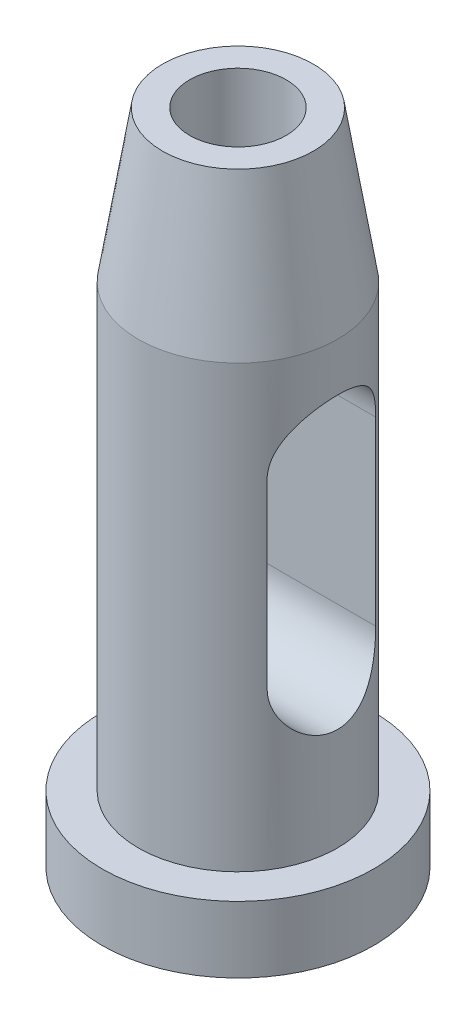
ISO-10303-21;
HEADER;
FILE_DESCRIPTION(('STEP AP214'),'2;1');
FILE_NAME('part.step','',(''),(''),'','','');
FILE_SCHEMA(('AUTOMOTIVE_DESIGN { 1 0 10303 214 1 1 1 1 }'));
ENDSEC;
DATA;
#1=APPLICATION_CONTEXT('core data for automotive mechanical design processes');
#2=APPLICATION_PROTOCOL_DEFINITION('international standard','automotive_design',2000,#1);
#3=PRODUCT_CONTEXT('',#1,'mechanical');
#4=PRODUCT('Part','Part','',(#3));
#5=PRODUCT_RELATED_PRODUCT_CATEGORY('part','',(#4));
#6=PRODUCT_DEFINITION_FORMATION('','',#4);
#7=PRODUCT_DEFINITION_CONTEXT('part definition',#1,'design');
#8=PRODUCT_DEFINITION('design','',#6,#7);
#9=PRODUCT_DEFINITION_SHAPE('','',#8);
#10=(LENGTH_UNIT() NAMED_UNIT(*) SI_UNIT(.MILLI.,.METRE.));
#11=(NAMED_UNIT(*) PLANE_ANGLE_UNIT() SI_UNIT($,.RADIAN.));
#12=(NAMED_UNIT(*) SI_UNIT($,.STERADIAN.) SOLID_ANGLE_UNIT());
#13=UNCERTAINTY_MEASURE_WITH_UNIT(LENGTH_MEASURE(1.E-05),#10,'distance_accuracy_value','');
#14=(GEOMETRIC_REPRESENTATION_CONTEXT(3) GLOBAL_UNCERTAINTY_ASSIGNED_CONTEXT((#13)) GLOBAL_UNIT_ASSIGNED_CONTEXT((#10,
#11,#12)) REPRESENTATION_CONTEXT('',''));
#15=CARTESIAN_POINT('',(0.,0.,0.));
#16=DIRECTION('',(0.,0.,1.));
#17=DIRECTION('',(1.,0.,0.));
#18=AXIS2_PLACEMENT_3D('',#15,#16,#17);
#19=CARTESIAN_POINT('',(0.,0.,0.));
#20=DIRECTION('',(0.,-1.,0.));
#21=DIRECTION('',(0.,0.,-1.));
#22=AXIS2_PLACEMENT_3D('',#19,#20,#21);
#23=PLANE('',#22);
#24=CARTESIAN_POINT('',(0.,0.,0.));
#25=DIRECTION('',(0.,1.,0.));
#26=DIRECTION('',(0.,0.,1.));
#27=AXIS2_PLACEMENT_3D('',#24,#25,#26);
#28=CIRCLE('',#27,22.5);
#29=CARTESIAN_POINT('',(0.,0.,22.5));
#30=VERTEX_POINT('',#29);
#31=EDGE_CURVE('E90',#30,#30,#28,.T.);
#32=ORIENTED_EDGE('',*,*,#31,.F.);
#33=EDGE_LOOP('',(#32));
#34=FACE_BOUND('',#33,.T.);
#35=ADVANCED_FACE('F40',(#34),#23,.T.);
#36=CARTESIAN_POINT('',(0.,109.,0.));
#37=DIRECTION('',(0.,1.,0.));
#38=DIRECTION('',(0.,0.,1.));
#39=AXIS2_PLACEMENT_3D('',#36,#37,#38);
#40=CYLINDRICAL_SURFACE('',#39,22.5);
#41=ORIENTED_EDGE('',*,*,#31,.T.);
#42=EDGE_LOOP('',(#41));
#43=FACE_BOUND('',#42,.T.);
#44=CARTESIAN_POINT('',(0.,11.,0.));
#45=DIRECTION('',(0.,1.,0.));
#46=DIRECTION('',(0.,0.,1.));
#47=AXIS2_PLACEMENT_3D('',#44,#45,#46);
#48=CIRCLE('',#47,22.5);
#49=CARTESIAN_POINT('',(0.,11.,22.5));
#50=VERTEX_POINT('',#49);
#51=EDGE_CURVE('E188',#50,#50,#48,.T.);
#52=ORIENTED_EDGE('',*,*,#51,.F.);
#53=EDGE_LOOP('',(#52));
#54=FACE_BOUND('',#53,.T.);
#55=ADVANCED_FACE('F196',(#43,#54),#40,.T.);
#56=CARTESIAN_POINT('',(0.,11.,22.5));
#57=DIRECTION('',(0.,1.,0.));
#58=DIRECTION('',(0.,0.,1.));
#59=AXIS2_PLACEMENT_3D('',#56,#57,#58);
#60=PLANE('',#59);
#61=ORIENTED_EDGE('',*,*,#51,.T.);
#62=EDGE_LOOP('',(#61));
#63=FACE_BOUND('',#62,.T.);
#64=CARTESIAN_POINT('',(0.,11.,0.));
#65=DIRECTION('',(0.,1.,0.));
#66=DIRECTION('',(0.,0.,1.));
#67=AXIS2_PLACEMENT_3D('',#64,#65,#66);
#68=CIRCLE('',#67,16.5);
#69=CARTESIAN_POINT('',(0.,11.,16.5));
#70=VERTEX_POINT('',#69);
#71=EDGE_CURVE('E184',#70,#70,#68,.T.);
#72=ORIENTED_EDGE('',*,*,#71,.F.);
#73=EDGE_LOOP('',(#72));
#74=FACE_BOUND('',#73,.T.);
#75=ADVANCED_FACE('F203',(#63,#74),#60,.T.);
#76=CARTESIAN_POINT('',(0.,109.,0.));
#77=DIRECTION('',(0.,1.,0.));
#78=DIRECTION('',(0.,0.,1.));
#79=AXIS2_PLACEMENT_3D('',#76,#77,#78);
#80=CYLINDRICAL_SURFACE('',#79,16.5);
#81=CARTESIAN_POINT('',(-13.8293166859393,37.,-9.));
#82=CARTESIAN_POINT('',(-13.8293134815957,36.883879337799,-9.00000108405973));
#83=CARTESIAN_POINT('',(-13.8307798704048,36.767775676521,-8.99775214358709));
#84=CARTESIAN_POINT('',(-13.8366193112443,36.535821083373,-8.98877121495076));
#85=CARTESIAN_POINT('',(-13.8409922095959,36.4199701384656,-8.98203946381126));
#86=CARTESIAN_POINT('',(-13.8584105490117,36.0733363645537,-8.95516299690755));
#87=CARTESIAN_POINT('',(-13.8757557630275,35.8432404071181,-8.92833699369042));
#88=CARTESIAN_POINT('',(-13.9210734017257,35.3884183518615,-8.85750818535109));
#89=CARTESIAN_POINT('',(-13.948973865982,35.1636666093085,-8.81362163589781));
#90=CARTESIAN_POINT('',(-14.0143719159858,34.7194526295796,-8.70925748833242));
#91=CARTESIAN_POINT('',(-14.051870928749,34.4999911842248,-8.64877742316692));
#92=CARTESIAN_POINT('',(-14.1350539016855,34.0683671001684,-8.51214530056127));
#93=CARTESIAN_POINT('',(-14.1807127706843,33.8561843989006,-8.43604118253432));
#94=CARTESIAN_POINT('',(-14.2788853710004,33.4394344654245,-8.26878667099399));
#95=CARTESIAN_POINT('',(-14.3314017477403,33.2348702115299,-8.17763046722479));
#96=CARTESIAN_POINT('',(-14.4971809528376,32.6334424598125,-7.88243166380446));
#97=CARTESIAN_POINT('',(-14.6185947922113,32.2492309081074,-7.65678284557668));
#98=CARTESIAN_POINT('',(-14.8838866236824,31.4844351884652,-7.12849041565851));
#99=CARTESIAN_POINT('',(-15.0287993297978,31.107936993416,-6.82045172463468));
#100=CARTESIAN_POINT('',(-15.2444045744132,30.5838378370052,-6.31599281999726));
#101=CARTESIAN_POINT('',(-15.3160142934886,30.4158391778875,-6.1406750094819));
#102=CARTESIAN_POINT('',(-15.4570552574956,30.0940974569534,-5.77646350594257));
#103=CARTESIAN_POINT('',(-15.5264861580652,29.9403566411547,-5.58756768228476));
#104=CARTESIAN_POINT('',(-15.6672413772283,29.6357479801947,-5.18051796077378));
#105=CARTESIAN_POINT('',(-15.7382291902257,29.4862228344667,-4.96124072193462));
#106=CARTESIAN_POINT('',(-15.8737205268866,29.2064140706764,-4.5089564833478));
#107=CARTESIAN_POINT('',(-15.9382268596804,29.0761221051991,-4.27595550165028));
#108=CARTESIAN_POINT('',(-16.058921036249,28.8360727806561,-3.79761413251478));
#109=CARTESIAN_POINT('',(-16.1151113722364,28.726309266829,-3.55227747159334));
#110=CARTESIAN_POINT('',(-16.2174945514722,28.5286196429743,-3.05094857264157));
#111=CARTESIAN_POINT('',(-16.2636886996486,28.4406906823871,-2.79495773064356));
#112=CARTESIAN_POINT('',(-16.3412924021232,28.2941761837752,-2.29578601596137));
#113=CARTESIAN_POINT('',(-16.3736041366231,28.2337747817225,-2.05327784299602));
#114=CARTESIAN_POINT('',(-16.4276612226378,28.1332161396188,-1.56293437886735));
#115=CARTESIAN_POINT('',(-16.4494071030839,28.0930578861836,-1.31509935501719));
#116=CARTESIAN_POINT('',(-16.4816853742424,28.0335861975899,-0.816366884020454));
#117=CARTESIAN_POINT('',(-16.4922245977025,28.0142600609005,-0.565471397355101));
#118=CARTESIAN_POINT('',(-16.5017954787214,27.9967054791063,-0.0627317539663012));
#119=CARTESIAN_POINT('',(-16.50082802665,27.9984754016194,0.189112327848731));
#120=CARTESIAN_POINT('',(-16.4881140513944,28.0218053769525,0.665502054373425));
#121=CARTESIAN_POINT('',(-16.4774903933769,28.0413039418605,0.890182334898735));
#122=CARTESIAN_POINT('',(-16.4472768638071,28.0969968405522,1.33685629531056));
#123=CARTESIAN_POINT('',(-16.4276869430148,28.1331912660244,1.55884996043612));
#124=CARTESIAN_POINT('',(-16.380001691922,28.2218538300547,1.99861633516903));
#125=CARTESIAN_POINT('',(-16.3519065907322,28.274321530248,2.21638915830833));
#126=CARTESIAN_POINT('',(-16.287850823767,28.3949611136514,2.64635039092244));
#127=CARTESIAN_POINT('',(-16.2518898544155,28.4631336029791,2.85853858450924));
#128=CARTESIAN_POINT('',(-16.1724544241406,28.6153386147169,3.27839087347572));
#129=CARTESIAN_POINT('',(-16.1289025338257,28.6995354951066,3.48598071121282));
#130=CARTESIAN_POINT('',(-16.0354892632859,28.882544427667,3.89317238156783));
#131=CARTESIAN_POINT('',(-15.9856258057915,28.9813612933985,4.09277155569199));
#132=CARTESIAN_POINT('',(-15.8280900344313,29.2985524826622,4.6780854188988));
#133=CARTESIAN_POINT('',(-15.7124221771135,29.5377607886603,5.05057142696184));
#134=CARTESIAN_POINT('',(-15.4556692787488,30.0938519193487,5.7915533699411));
#135=CARTESIAN_POINT('',(-15.3131891684231,30.416296453486,6.1553916221143));
#136=CARTESIAN_POINT('',(-15.0979492139108,30.9400196925103,6.65848604251197));
#137=CARTESIAN_POINT('',(-15.0258813463276,31.1214581254447,6.81920359907351));
#138=CARTESIAN_POINT('',(-14.8829449335362,31.4970705530637,7.12576361305457));
#139=CARTESIAN_POINT('',(-14.8120765967277,31.6912467327344,7.27160350739421));
#140=CARTESIAN_POINT('',(-14.667370449346,32.1088482757656,7.55952537759443));
#141=CARTESIAN_POINT('',(-14.593807402387,32.3333501755625,7.70018681476335));
#142=CARTESIAN_POINT('',(-14.4527381260324,32.7952459242011,7.96181155290304));
#143=CARTESIAN_POINT('',(-14.3852291413342,33.0326338286299,8.08278383536833));
#144=CARTESIAN_POINT('',(-14.2588712919875,33.5185749971631,8.3036590486665));
#145=CARTESIAN_POINT('',(-14.2000033794566,33.76710207738,8.40360853825212));
#146=CARTESIAN_POINT('',(-14.0932226684338,34.2741530660208,8.58148374258627));
#147=CARTESIAN_POINT('',(-14.0453053206661,34.5326727707568,8.65941860622515));
#148=CARTESIAN_POINT('',(-13.9759024717337,34.9734488902373,8.77080106889329));
#149=CARTESIAN_POINT('',(-13.9508676002974,35.1535934284484,8.81050140549166));
#150=CARTESIAN_POINT('',(-13.9074662102012,35.5167275050034,8.87885237923901));
#151=CARTESIAN_POINT('',(-13.8890977900302,35.6997162165327,8.90750616740534));
#152=CARTESIAN_POINT('',(-13.8594431186528,36.0683513246452,8.95358220283994));
#153=CARTESIAN_POINT('',(-13.8481827209869,36.2540049395411,8.97096345546967));
#154=CARTESIAN_POINT('',(-13.8331000847177,36.6264335118903,8.99418564095055));
#155=CARTESIAN_POINT('',(-13.8292819358322,36.8132090293461,9.00002022862284));
#156=CARTESIAN_POINT('',(-13.8293166859393,37.,9.));
#157=B_SPLINE_CURVE_WITH_KNOTS('',3,(#81,#82,#83,#84,#85,#86,#87,#88,#89,#90,#91,#92,#93,#94,
#95,#96,#97,#98,#99,#100,#101,#102,#103,#104,#105,#106,#107,#108,#109,#110,#111,#112,#113,#114,
#115,#116,#117,#118,#119,#120,#121,#122,#123,#124,#125,#126,#127,#128,#129,#130,#131,#132,#133,
#134,#135,#136,#137,#138,#139,#140,#141,#142,#143,#144,#145,#146,#147,#148,#149,#150,#151,#152,
#153,#154,#155,#156),.UNSPECIFIED.,.F.,.F.,(4,2,2,2,2,2,2,2,2,2,2,2,2,2,2,2,2,2,2,2,2,2,2,2,2,2,
2,2,2,2,2,2,2,2,2,2,2,4),(0.,0.348297459707134,0.696576504992709,1.39244069466339,
2.08364390864056,2.77494994351385,3.46416571704895,4.15364815938686,5.53384137472792,
7.05000030935543,7.80883706644962,8.56779315968766,9.39093850464086,10.2137255382555,
11.0362654901795,11.8586980007831,12.6136393478522,13.3685428983421,14.1229859164749,
14.8773705572975,15.5538916107622,16.2304163795213,16.9069229258351,17.5834555859257,
18.2673428369038,18.9514557576741,20.3188620596813,21.8320268865112,22.5900243598057,
23.348152198926,24.1719696394774,24.9954102240249,25.8170074892098,26.6382628090292,
27.1963145005412,27.7542068903533,28.3141169470546,28.8743346028807),.UNSPECIFIED.);
#158=CARTESIAN_POINT('',(-13.8293166859393,37.,-9.));
#159=VERTEX_POINT('',#158);
#160=CARTESIAN_POINT('',(-13.8293166859393,37.,9.));
#161=VERTEX_POINT('',#160);
#162=EDGE_CURVE('E11',#159,#161,#157,.T.);
#163=ORIENTED_EDGE('',*,*,#162,.F.);
#164=DIRECTION('',(0.,1.,0.));
#165=VECTOR('',#164,1.);
#166=CARTESIAN_POINT('',(-13.8293166859393,109.,-9.));
#167=LINE('',#166,#165);
#168=CARTESIAN_POINT('',(-13.8293166859393,67.,-9.));
#169=VERTEX_POINT('',#168);
#170=EDGE_CURVE('E139',#169,#159,#167,.F.);
#171=ORIENTED_EDGE('',*,*,#170,.F.);
#172=CARTESIAN_POINT('',(-13.8293166859393,67.,9.));
#173=CARTESIAN_POINT('',(-13.8293134815957,67.116120662201,9.00000108405973));
#174=CARTESIAN_POINT('',(-13.8307798704048,67.232224323479,8.99775214358709));
#175=CARTESIAN_POINT('',(-13.8366193112443,67.464178916627,8.98877121495076));
#176=CARTESIAN_POINT('',(-13.8409922095959,67.5800298615344,8.98203946381125));
#177=CARTESIAN_POINT('',(-13.8584105490117,67.9266636354463,8.95516299690755));
#178=CARTESIAN_POINT('',(-13.8757557630275,68.1567595928819,8.92833699369042));
#179=CARTESIAN_POINT('',(-13.9210734017257,68.6115816481385,8.85750818535109));
#180=CARTESIAN_POINT('',(-13.948973865982,68.8363333906915,8.8136216358978));
#181=CARTESIAN_POINT('',(-14.0143719159858,69.2805473704204,8.70925748833241));
#182=CARTESIAN_POINT('',(-14.051870928749,69.5000088157752,8.64877742316692));
#183=CARTESIAN_POINT('',(-14.1350539016855,69.9316328998316,8.51214530056127));
#184=CARTESIAN_POINT('',(-14.1807127706843,70.1438156010994,8.43604118253433));
#185=CARTESIAN_POINT('',(-14.2788853710004,70.5605655345755,8.268786670994));
#186=CARTESIAN_POINT('',(-14.3314017477403,70.7651297884701,8.17763046722479));
#187=CARTESIAN_POINT('',(-14.4971809528376,71.3665575401875,7.88243166380445));
#188=CARTESIAN_POINT('',(-14.6185947922114,71.7507690918926,7.65678284557668));
#189=CARTESIAN_POINT('',(-14.8838866236824,72.5155648115348,7.12849041565851));
#190=CARTESIAN_POINT('',(-15.0287993297978,72.892063006584,6.82045172463468));
#191=CARTESIAN_POINT('',(-15.2444045744132,73.4161621629948,6.31599281999725));
#192=CARTESIAN_POINT('',(-15.3160142934886,73.5841608221125,6.14067500948189));
#193=CARTESIAN_POINT('',(-15.4570552574956,73.9059025430467,5.77646350594256));
#194=CARTESIAN_POINT('',(-15.5264861580652,74.0596433588453,5.58756768228475));
#195=CARTESIAN_POINT('',(-15.6672413772284,74.3642520198053,5.18051796077377));
#196=CARTESIAN_POINT('',(-15.7382291902257,74.5137771655333,4.96124072193461));
#197=CARTESIAN_POINT('',(-15.8737205268866,74.7935859293236,4.5089564833478));
#198=CARTESIAN_POINT('',(-15.9382268596804,74.9238778948009,4.27595550165028));
#199=CARTESIAN_POINT('',(-16.058921036249,75.1639272193439,3.79761413251478));
#200=CARTESIAN_POINT('',(-16.1151113722364,75.273690733171,3.55227747159334));
#201=CARTESIAN_POINT('',(-16.2174945514722,75.4713803570257,3.05094857264157));
#202=CARTESIAN_POINT('',(-16.2636886996486,75.5593093176129,2.79495773064357));
#203=CARTESIAN_POINT('',(-16.3412924021232,75.7058238162248,2.29578601596138));
#204=CARTESIAN_POINT('',(-16.3736041366231,75.7662252182775,2.05327784299602));
#205=CARTESIAN_POINT('',(-16.4276612226378,75.8667838603812,1.56293437886736));
#206=CARTESIAN_POINT('',(-16.4494071030839,75.9069421138164,1.3150993550172));
#207=CARTESIAN_POINT('',(-16.4816853742424,75.9664138024101,0.816366884020461));
#208=CARTESIAN_POINT('',(-16.4922245977025,75.9857399390995,0.565471397355108));
#209=CARTESIAN_POINT('',(-16.5017954787214,76.0032945208937,0.0627317539663093));
#210=CARTESIAN_POINT('',(-16.50082802665,76.0015245983806,-0.189112327848721));
#211=CARTESIAN_POINT('',(-16.4881140513944,75.9781946230475,-0.665502054373416));
#212=CARTESIAN_POINT('',(-16.4774903933769,75.9586960581395,-0.890182334898726));
#213=CARTESIAN_POINT('',(-16.4472768638071,75.9030031594478,-1.33685629531055));
#214=CARTESIAN_POINT('',(-16.4276869430148,75.8668087339756,-1.55884996043611));
#215=CARTESIAN_POINT('',(-16.380001691922,75.7781461699453,-1.99861633516902));
#216=CARTESIAN_POINT('',(-16.3519065907322,75.725678469752,-2.21638915830832));
#217=CARTESIAN_POINT('',(-16.287850823767,75.6050388863487,-2.64635039092243));
#218=CARTESIAN_POINT('',(-16.2518898544155,75.5368663970209,-2.85853858450924));
#219=CARTESIAN_POINT('',(-16.1724544241406,75.3846613852831,-3.27839087347571));
#220=CARTESIAN_POINT('',(-16.1289025338257,75.3004645048934,-3.48598071121281));
#221=CARTESIAN_POINT('',(-16.0354892632859,75.117455572333,-3.89317238156782));
#222=CARTESIAN_POINT('',(-15.9856258057915,75.0186387066015,-4.09277155569198));
#223=CARTESIAN_POINT('',(-15.8280900344313,74.7014475173378,-4.67808541889879));
#224=CARTESIAN_POINT('',(-15.7124221771135,74.4622392113397,-5.05057142696183));
#225=CARTESIAN_POINT('',(-15.4556692787488,73.9061480806513,-5.7915533699411));
#226=CARTESIAN_POINT('',(-15.3131891684231,73.5837035465141,-6.1553916221143));
#227=CARTESIAN_POINT('',(-15.0979492139108,73.0599803074897,-6.65848604251197));
#228=CARTESIAN_POINT('',(-15.0258813463276,72.8785418745553,-6.8192035990735));
#229=CARTESIAN_POINT('',(-14.8829449335362,72.5029294469363,-7.12576361305456));
#230=CARTESIAN_POINT('',(-14.8120765967277,72.3087532672656,-7.27160350739421));
#231=CARTESIAN_POINT('',(-14.667370449346,71.8911517242344,-7.55952537759443));
#232=CARTESIAN_POINT('',(-14.593807402387,71.6666498244375,-7.70018681476335));
#233=CARTESIAN_POINT('',(-14.4527381260324,71.2047540757989,-7.96181155290304));
#234=CARTESIAN_POINT('',(-14.3852291413342,70.9673661713701,-8.08278383536833));
#235=CARTESIAN_POINT('',(-14.2588712919875,70.4814250028369,-8.30365904866649));
#236=CARTESIAN_POINT('',(-14.2000033794566,70.23289792262,-8.40360853825212));
#237=CARTESIAN_POINT('',(-14.0932226684338,69.7258469339792,-8.58148374258626));
#238=CARTESIAN_POINT('',(-14.045305320666,69.4673272292432,-8.65941860622514));
#239=CARTESIAN_POINT('',(-13.9759024717337,69.0265511097627,-8.77080106889329));
#240=CARTESIAN_POINT('',(-13.9508676002974,68.8464065715516,-8.81050140549166));
#241=CARTESIAN_POINT('',(-13.9074662102012,68.4832724949966,-8.87885237923901));
#242=CARTESIAN_POINT('',(-13.8890977900302,68.3002837834673,-8.90750616740534));
#243=CARTESIAN_POINT('',(-13.8594431186528,67.9316486753548,-8.95358220283994));
#244=CARTESIAN_POINT('',(-13.8481827209869,67.7459950604589,-8.97096345546966));
#245=CARTESIAN_POINT('',(-13.8331000847177,67.3735664881097,-8.99418564095055));
#246=CARTESIAN_POINT('',(-13.8292819358322,67.186790970654,-9.00002022862284));
#247=CARTESIAN_POINT('',(-13.8293166859393,67.,-9.));
#248=B_SPLINE_CURVE_WITH_KNOTS('',3,(#172,#173,#174,#175,#176,#177,#178,#179,#180,#181,#182,
#183,#184,#185,#186,#187,#188,#189,#190,#191,#192,#193,#194,#195,#196,#197,#198,#199,#200,#201,
#202,#203,#204,#205,#206,#207,#208,#209,#210,#211,#212,#213,#214,#215,#216,#217,#218,#219,#220,
#221,#222,#223,#224,#225,#226,#227,#228,#229,#230,#231,#232,#233,#234,#235,#236,#237,#238,#239,
#240,#241,#242,#243,#244,#245,#246,#247),.UNSPECIFIED.,.F.,.F.,(4,2,2,2,2,2,2,2,2,2,2,2,2,2,2,2,
2,2,2,2,2,2,2,2,2,2,2,2,2,2,2,2,2,2,2,2,2,4),(0.,0.348297459707154,0.696576504992716,
1.3924406946634,2.08364390864056,2.77494994351385,3.46416571704895,4.15364815938687,
5.53384137472791,7.05000030935543,7.80883706644962,8.56779315968767,9.39093850464086,
10.2137255382555,11.0362654901795,11.8586980007831,12.6136393478522,13.3685428983421,
14.1229859164749,14.8773705572975,15.5538916107622,16.2304163795213,16.9069229258351,
17.5834555859257,18.2673428369038,18.951455757674,20.3188620596813,21.8320268865112,
22.5900243598057,23.348152198926,24.1719696394774,24.9954102240249,25.8170074892098,
26.6382628090292,27.1963145005412,27.7542068903533,28.3141169470545,28.8743346028807),.UNSPECIFIED.);
#249=CARTESIAN_POINT('',(-13.8293166859393,67.,9.));
#250=VERTEX_POINT('',#249);
#251=EDGE_CURVE('E97',#250,#169,#248,.T.);
#252=ORIENTED_EDGE('',*,*,#251,.F.);
#253=DIRECTION('',(0.,1.,0.));
#254=VECTOR('',#253,1.);
#255=CARTESIAN_POINT('',(-13.8293166859393,109.,9.));
#256=LINE('',#255,#254);
#257=EDGE_CURVE('E54',#161,#250,#256,.T.);
#258=ORIENTED_EDGE('',*,*,#257,.F.);
#259=EDGE_LOOP('',(#163,#171,#252,#258));
#260=FACE_BOUND('',#259,.T.);
#261=CARTESIAN_POINT('',(13.8293166859393,37.,9.));
#262=CARTESIAN_POINT('',(13.8293134815957,36.883879337799,9.00000108405973));
#263=CARTESIAN_POINT('',(13.8307798704048,36.767775676521,8.99775214358709));
#264=CARTESIAN_POINT('',(13.8366193112443,36.535821083373,8.98877121495076));
#265=CARTESIAN_POINT('',(13.8409922095959,36.4199701384656,8.98203946381126));
#266=CARTESIAN_POINT('',(13.8584105490117,36.0733363645537,8.95516299690755));
#267=CARTESIAN_POINT('',(13.8757557630275,35.8432404071181,8.92833699369042));
#268=CARTESIAN_POINT('',(13.9210734017257,35.3884183518615,8.85750818535109));
#269=CARTESIAN_POINT('',(13.948973865982,35.1636666093085,8.81362163589781));
#270=CARTESIAN_POINT('',(14.0143719159858,34.7194526295796,8.70925748833242));
#271=CARTESIAN_POINT('',(14.051870928749,34.4999911842248,8.64877742316692));
#272=CARTESIAN_POINT('',(14.1350539016855,34.0683671001684,8.51214530056127));
#273=CARTESIAN_POINT('',(14.1807127706843,33.8561843989006,8.43604118253432));
#274=CARTESIAN_POINT('',(14.2788853710004,33.4394344654245,8.26878667099399));
#275=CARTESIAN_POINT('',(14.3314017477403,33.2348702115299,8.17763046722479));
#276=CARTESIAN_POINT('',(14.4971809528376,32.6334424598125,7.88243166380446));
#277=CARTESIAN_POINT('',(14.6185947922113,32.2492309081074,7.65678284557669));
#278=CARTESIAN_POINT('',(14.8838866236824,31.4844351884652,7.12849041565851));
#279=CARTESIAN_POINT('',(15.0287993297978,31.107936993416,6.82045172463468));
#280=CARTESIAN_POINT('',(15.2444045744132,30.5838378370052,6.31599281999726));
#281=CARTESIAN_POINT('',(15.3160142934885,30.4158391778875,6.1406750094819));
#282=CARTESIAN_POINT('',(15.4570552574956,30.0940974569534,5.77646350594258));
#283=CARTESIAN_POINT('',(15.5264861580652,29.9403566411547,5.58756768228476));
#284=CARTESIAN_POINT('',(15.6672413772284,29.6357479801947,5.18051796077379));
#285=CARTESIAN_POINT('',(15.7382291902257,29.4862228344667,4.96124072193463));
#286=CARTESIAN_POINT('',(15.8737205268866,29.2064140706764,4.50895648334781));
#287=CARTESIAN_POINT('',(15.9382268596804,29.0761221051991,4.27595550165029));
#288=CARTESIAN_POINT('',(16.058921036249,28.8360727806561,3.79761413251478));
#289=CARTESIAN_POINT('',(16.1151113722364,28.726309266829,3.55227747159334));
#290=CARTESIAN_POINT('',(16.2174945514722,28.5286196429743,3.05094857264157));
#291=CARTESIAN_POINT('',(16.2636886996486,28.4406906823871,2.79495773064357));
#292=CARTESIAN_POINT('',(16.3412924021232,28.2941761837752,2.29578601596138));
#293=CARTESIAN_POINT('',(16.3736041366231,28.2337747817225,2.05327784299602));
#294=CARTESIAN_POINT('',(16.4276612226378,28.1332161396188,1.56293437886736));
#295=CARTESIAN_POINT('',(16.4494071030839,28.0930578861836,1.3150993550172));
#296=CARTESIAN_POINT('',(16.4816853742424,28.0335861975899,0.816366884020459));
#297=CARTESIAN_POINT('',(16.4922245977025,28.0142600609005,0.565471397355106));
#298=CARTESIAN_POINT('',(16.5017954787214,27.9967054791063,0.062731753966306));
#299=CARTESIAN_POINT('',(16.50082802665,27.9984754016194,-0.189112327848726));
#300=CARTESIAN_POINT('',(16.4881140513944,28.0218053769525,-0.665502054373421));
#301=CARTESIAN_POINT('',(16.4774903933769,28.0413039418605,-0.890182334898731));
#302=CARTESIAN_POINT('',(16.4472768638071,28.0969968405522,-1.33685629531056));
#303=CARTESIAN_POINT('',(16.4276869430148,28.1331912660244,-1.55884996043611));
#304=CARTESIAN_POINT('',(16.380001691922,28.2218538300547,-1.99861633516903));
#305=CARTESIAN_POINT('',(16.3519065907322,28.274321530248,-2.21638915830833));
#306=CARTESIAN_POINT('',(16.287850823767,28.3949611136514,-2.64635039092244));
#307=CARTESIAN_POINT('',(16.2518898544155,28.4631336029791,-2.85853858450924));
#308=CARTESIAN_POINT('',(16.1724544241406,28.6153386147169,-3.27839087347572));
#309=CARTESIAN_POINT('',(16.1289025338257,28.6995354951066,-3.48598071121282));
#310=CARTESIAN_POINT('',(16.0354892632859,28.882544427667,-3.89317238156783));
#311=CARTESIAN_POINT('',(15.9856258057915,28.9813612933985,-4.09277155569198));
#312=CARTESIAN_POINT('',(15.8280900344313,29.2985524826622,-4.67808541889879));
#313=CARTESIAN_POINT('',(15.7124221771135,29.5377607886603,-5.05057142696184));
#314=CARTESIAN_POINT('',(15.4556692787488,30.0938519193487,-5.7915533699411));
#315=CARTESIAN_POINT('',(15.3131891684231,30.416296453486,-6.1553916221143));
#316=CARTESIAN_POINT('',(15.0979492139108,30.9400196925103,-6.65848604251197));
#317=CARTESIAN_POINT('',(15.0258813463276,31.1214581254447,-6.81920359907351));
#318=CARTESIAN_POINT('',(14.8829449335362,31.4970705530637,-7.12576361305457));
#319=CARTESIAN_POINT('',(14.8120765967277,31.6912467327344,-7.27160350739421));
#320=CARTESIAN_POINT('',(14.667370449346,32.1088482757656,-7.55952537759443));
#321=CARTESIAN_POINT('',(14.593807402387,32.3333501755625,-7.70018681476335));
#322=CARTESIAN_POINT('',(14.4527381260324,32.7952459242011,-7.96181155290304));
#323=CARTESIAN_POINT('',(14.3852291413342,33.0326338286299,-8.08278383536833));
#324=CARTESIAN_POINT('',(14.2588712919875,33.5185749971631,-8.3036590486665));
#325=CARTESIAN_POINT('',(14.2000033794566,33.76710207738,-8.40360853825212));
#326=CARTESIAN_POINT('',(14.0932226684338,34.2741530660208,-8.58148374258626));
#327=CARTESIAN_POINT('',(14.045305320666,34.5326727707568,-8.65941860622515));
#328=CARTESIAN_POINT('',(13.9759024717337,34.9734488902373,-8.7708010688933));
#329=CARTESIAN_POINT('',(13.9508676002974,35.1535934284484,-8.81050140549166));
#330=CARTESIAN_POINT('',(13.9074662102012,35.5167275050034,-8.87885237923901));
#331=CARTESIAN_POINT('',(13.8890977900302,35.6997162165327,-8.90750616740534));
#332=CARTESIAN_POINT('',(13.8594431186528,36.0683513246453,-8.95358220283994));
#333=CARTESIAN_POINT('',(13.8481827209869,36.2540049395412,-8.97096345546967));
#334=CARTESIAN_POINT('',(13.8331000847177,36.6264335118903,-8.99418564095055));
#335=CARTESIAN_POINT('',(13.8292819358322,36.8132090293461,-9.00002022862284));
#336=CARTESIAN_POINT('',(13.8293166859393,37.,-9.));
#337=B_SPLINE_CURVE_WITH_KNOTS('',3,(#261,#262,#263,#264,#265,#266,#267,#268,#269,#270,#271,
#272,#273,#274,#275,#276,#277,#278,#279,#280,#281,#282,#283,#284,#285,#286,#287,#288,#289,#290,
#291,#292,#293,#294,#295,#296,#297,#298,#299,#300,#301,#302,#303,#304,#305,#306,#307,#308,#309,
#310,#311,#312,#313,#314,#315,#316,#317,#318,#319,#320,#321,#322,#323,#324,#325,#326,#327,#328,
#329,#330,#331,#332,#333,#334,#335,#336),.UNSPECIFIED.,.F.,.F.,(4,2,2,2,2,2,2,2,2,2,2,2,2,2,2,2,
2,2,2,2,2,2,2,2,2,2,2,2,2,2,2,2,2,2,2,2,2,4),(0.,0.348297459707134,0.696576504992709,
1.39244069466339,2.08364390864056,2.77494994351385,3.46416571704895,4.15364815938686,
5.53384137472792,7.05000030935542,7.80883706644961,8.56779315968765,9.39093850464085,
10.2137255382555,11.0362654901795,11.8586980007831,12.6136393478522,13.3685428983421,
14.1229859164749,14.8773705572975,15.5538916107622,16.2304163795213,16.9069229258351,
17.5834555859257,18.2673428369038,18.951455757674,20.3188620596813,21.8320268865112,
22.5900243598057,23.348152198926,24.1719696394774,24.9954102240249,25.8170074892098,
26.6382628090292,27.1963145005412,27.7542068903533,28.3141169470546,28.8743346028807),.UNSPECIFIED.);
#338=CARTESIAN_POINT('',(13.8293166859393,37.,9.));
#339=VERTEX_POINT('',#338);
#340=CARTESIAN_POINT('',(13.8293166859393,37.,-9.));
#341=VERTEX_POINT('',#340);
#342=EDGE_CURVE('E110',#339,#341,#337,.T.);
#343=ORIENTED_EDGE('',*,*,#342,.F.);
#344=DIRECTION('',(0.,1.,0.));
#345=VECTOR('',#344,1.);
#346=CARTESIAN_POINT('',(13.8293166859393,109.,9.));
#347=LINE('',#346,#345);
#348=CARTESIAN_POINT('',(13.8293166859393,67.,9.));
#349=VERTEX_POINT('',#348);
#350=EDGE_CURVE('E105',#349,#339,#347,.F.);
#351=ORIENTED_EDGE('',*,*,#350,.F.);
#352=CARTESIAN_POINT('',(13.8293166859393,67.,-9.));
#353=CARTESIAN_POINT('',(13.8293134815957,67.116120662201,-9.00000108405973));
#354=CARTESIAN_POINT('',(13.8307798704048,67.232224323479,-8.99775214358709));
#355=CARTESIAN_POINT('',(13.8366193112443,67.464178916627,-8.98877121495076));
#356=CARTESIAN_POINT('',(13.8409922095959,67.5800298615344,-8.98203946381125));
#357=CARTESIAN_POINT('',(13.8584105490117,67.9266636354462,-8.95516299690755));
#358=CARTESIAN_POINT('',(13.8757557630275,68.1567595928819,-8.92833699369042));
#359=CARTESIAN_POINT('',(13.9210734017257,68.6115816481384,-8.8575081853511));
#360=CARTESIAN_POINT('',(13.948973865982,68.8363333906915,-8.81362163589781));
#361=CARTESIAN_POINT('',(14.0143719159858,69.2805473704204,-8.70925748833242));
#362=CARTESIAN_POINT('',(14.051870928749,69.5000088157752,-8.64877742316692));
#363=CARTESIAN_POINT('',(14.1350539016855,69.9316328998316,-8.51214530056128));
#364=CARTESIAN_POINT('',(14.1807127706843,70.1438156010994,-8.43604118253433));
#365=CARTESIAN_POINT('',(14.2788853710004,70.5605655345755,-8.26878667099401));
#366=CARTESIAN_POINT('',(14.3314017477402,70.7651297884701,-8.1776304672248));
#367=CARTESIAN_POINT('',(14.4971809528376,71.3665575401875,-7.88243166380447));
#368=CARTESIAN_POINT('',(14.6185947922113,71.7507690918926,-7.6567828455767));
#369=CARTESIAN_POINT('',(14.8838866236824,72.5155648115348,-7.12849041565853));
#370=CARTESIAN_POINT('',(15.0287993297978,72.892063006584,-6.82045172463469));
#371=CARTESIAN_POINT('',(15.2444045744132,73.4161621629948,-6.31599281999727));
#372=CARTESIAN_POINT('',(15.3160142934885,73.5841608221125,-6.14067500948192));
#373=CARTESIAN_POINT('',(15.4570552574956,73.9059025430466,-5.77646350594259));
#374=CARTESIAN_POINT('',(15.5264861580652,74.0596433588453,-5.58756768228478));
#375=CARTESIAN_POINT('',(15.6672413772283,74.3642520198052,-5.18051796077381));
#376=CARTESIAN_POINT('',(15.7382291902257,74.5137771655333,-4.96124072193464));
#377=CARTESIAN_POINT('',(15.8737205268866,74.7935859293236,-4.50895648334782));
#378=CARTESIAN_POINT('',(15.9382268596804,74.9238778948009,-4.2759555016503));
#379=CARTESIAN_POINT('',(16.058921036249,75.1639272193439,-3.7976141325148));
#380=CARTESIAN_POINT('',(16.1151113722363,75.273690733171,-3.55227747159337));
#381=CARTESIAN_POINT('',(16.2174945514722,75.4713803570257,-3.05094857264159));
#382=CARTESIAN_POINT('',(16.2636886996486,75.5593093176129,-2.79495773064358));
#383=CARTESIAN_POINT('',(16.3412924021232,75.7058238162248,-2.2957860159614));
#384=CARTESIAN_POINT('',(16.3736041366231,75.7662252182775,-2.05327784299604));
#385=CARTESIAN_POINT('',(16.4276612226378,75.8667838603812,-1.56293437886738));
#386=CARTESIAN_POINT('',(16.4494071030839,75.9069421138164,-1.31509935501722));
#387=CARTESIAN_POINT('',(16.4816853742424,75.9664138024101,-0.816366884020478));
#388=CARTESIAN_POINT('',(16.4922245977025,75.9857399390995,-0.565471397355126));
#389=CARTESIAN_POINT('',(16.5017954787214,76.0032945208937,-0.0627317539663271));
#390=CARTESIAN_POINT('',(16.50082802665,76.0015245983806,0.189112327848703));
#391=CARTESIAN_POINT('',(16.4881140513944,75.9781946230475,0.665502054373398));
#392=CARTESIAN_POINT('',(16.4774903933769,75.9586960581395,0.890182334898709));
#393=CARTESIAN_POINT('',(16.4472768638071,75.9030031594478,1.33685629531053));
#394=CARTESIAN_POINT('',(16.4276869430148,75.8668087339756,1.55884996043609));
#395=CARTESIAN_POINT('',(16.380001691922,75.7781461699453,1.99861633516901));
#396=CARTESIAN_POINT('',(16.3519065907322,75.725678469752,2.2163891583083));
#397=CARTESIAN_POINT('',(16.287850823767,75.6050388863487,2.64635039092242));
#398=CARTESIAN_POINT('',(16.2518898544155,75.5368663970209,2.85853858450922));
#399=CARTESIAN_POINT('',(16.1724544241406,75.3846613852831,3.2783908734757));
#400=CARTESIAN_POINT('',(16.1289025338257,75.3004645048934,3.4859807112128));
#401=CARTESIAN_POINT('',(16.0354892632859,75.117455572333,3.89317238156781));
#402=CARTESIAN_POINT('',(15.9856258057915,75.0186387066015,4.09277155569197));
#403=CARTESIAN_POINT('',(15.8280900344313,74.7014475173378,4.67808541889878));
#404=CARTESIAN_POINT('',(15.7124221771135,74.4622392113397,5.05057142696182));
#405=CARTESIAN_POINT('',(15.4556692787488,73.9061480806513,5.79155336994109));
#406=CARTESIAN_POINT('',(15.3131891684231,73.5837035465141,6.15539162211429));
#407=CARTESIAN_POINT('',(15.0979492139108,73.0599803074897,6.65848604251196));
#408=CARTESIAN_POINT('',(15.0258813463276,72.8785418745553,6.8192035990735));
#409=CARTESIAN_POINT('',(14.8829449335362,72.5029294469363,7.12576361305455));
#410=CARTESIAN_POINT('',(14.8120765967277,72.3087532672656,7.2716035073942));
#411=CARTESIAN_POINT('',(14.667370449346,71.8911517242345,7.55952537759442));
#412=CARTESIAN_POINT('',(14.593807402387,71.6666498244375,7.70018681476334));
#413=CARTESIAN_POINT('',(14.4527381260324,71.2047540757989,7.96181155290303));
#414=CARTESIAN_POINT('',(14.3852291413342,70.9673661713701,8.08278383536832));
#415=CARTESIAN_POINT('',(14.2588712919875,70.4814250028369,8.30365904866649));
#416=CARTESIAN_POINT('',(14.2000033794566,70.23289792262,8.40360853825212));
#417=CARTESIAN_POINT('',(14.0932226684338,69.7258469339792,8.58148374258626));
#418=CARTESIAN_POINT('',(14.0453053206661,69.4673272292432,8.65941860622514));
#419=CARTESIAN_POINT('',(13.9759024717337,69.0265511097627,8.77080106889329));
#420=CARTESIAN_POINT('',(13.9508676002974,68.8464065715517,8.81050140549166));
#421=CARTESIAN_POINT('',(13.9074662102012,68.4832724949966,8.87885237923901));
#422=CARTESIAN_POINT('',(13.8890977900302,68.3002837834673,8.90750616740534));
#423=CARTESIAN_POINT('',(13.8594431186528,67.9316486753548,8.95358220283994));
#424=CARTESIAN_POINT('',(13.8481827209869,67.7459950604589,8.97096345546967));
#425=CARTESIAN_POINT('',(13.8331000847177,67.3735664881097,8.99418564095055));
#426=CARTESIAN_POINT('',(13.8292819358322,67.1867909706539,9.00002022862284));
#427=CARTESIAN_POINT('',(13.8293166859393,67.,9.));
#428=B_SPLINE_CURVE_WITH_KNOTS('',3,(#352,#353,#354,#355,#356,#357,#358,#359,#360,#361,#362,
#363,#364,#365,#366,#367,#368,#369,#370,#371,#372,#373,#374,#375,#376,#377,#378,#379,#380,#381,
#382,#383,#384,#385,#386,#387,#388,#389,#390,#391,#392,#393,#394,#395,#396,#397,#398,#399,#400,
#401,#402,#403,#404,#405,#406,#407,#408,#409,#410,#411,#412,#413,#414,#415,#416,#417,#418,#419,
#420,#421,#422,#423,#424,#425,#426,#427),.UNSPECIFIED.,.F.,.F.,(4,2,2,2,2,2,2,2,2,2,2,2,2,2,2,2,
2,2,2,2,2,2,2,2,2,2,2,2,2,2,2,2,2,2,2,2,2,4),(0.,0.348297459707154,0.696576504992716,
1.39244069466337,2.08364390864053,2.77494994351384,3.46416571704892,4.15364815938683,
5.53384137472789,7.05000030935541,7.80883706644959,8.56779315968763,9.39093850464083,
10.2137255382555,11.0362654901795,11.8586980007831,12.6136393478522,13.3685428983421,
14.1229859164748,14.8773705572975,15.5538916107622,16.2304163795213,16.9069229258351,
17.5834555859257,18.2673428369038,18.951455757674,20.3188620596813,21.8320268865112,
22.5900243598057,23.348152198926,24.1719696394774,24.9954102240249,25.8170074892098,
26.6382628090292,27.1963145005412,27.7542068903533,28.3141169470546,28.8743346028807),.UNSPECIFIED.);
#429=CARTESIAN_POINT('',(13.8293166859393,67.,-9.));
#430=VERTEX_POINT('',#429);
#431=EDGE_CURVE('E89',#430,#349,#428,.T.);
#432=ORIENTED_EDGE('',*,*,#431,.F.);
#433=DIRECTION('',(0.,1.,0.));
#434=VECTOR('',#433,1.);
#435=CARTESIAN_POINT('',(13.8293166859393,109.,-9.));
#436=LINE('',#435,#434);
#437=EDGE_CURVE('E83',#341,#430,#436,.T.);
#438=ORIENTED_EDGE('',*,*,#437,.F.);
#439=EDGE_LOOP('',(#343,#351,#432,#438));
#440=FACE_BOUND('',#439,.T.);
#441=ORIENTED_EDGE('',*,*,#71,.T.);
#442=EDGE_LOOP('',(#441));
#443=FACE_BOUND('',#442,.T.);
#444=CARTESIAN_POINT('',(0.,84.,0.));
#445=DIRECTION('',(0.,1.,0.));
#446=DIRECTION('',(0.,0.,1.));
#447=AXIS2_PLACEMENT_3D('',#444,#445,#446);
#448=CIRCLE('',#447,16.5);
#449=CARTESIAN_POINT('',(0.,84.,16.5));
#450=VERTEX_POINT('',#449);
#451=EDGE_CURVE('E180',#450,#450,#448,.T.);
#452=ORIENTED_EDGE('',*,*,#451,.F.);
#453=EDGE_LOOP('',(#452));
#454=FACE_BOUND('',#453,.T.);
#455=ADVANCED_FACE('F103',(#260,#440,#443,#454),#80,.T.);
#456=CARTESIAN_POINT('',(0.,109.,0.));
#457=DIRECTION('',(0.,-1.,0.));
#458=DIRECTION('',(0.,0.,-1.));
#459=AXIS2_PLACEMENT_3D('',#456,#457,#458);
#460=CONICAL_SURFACE('',#459,12.5,0.158655262186401);
#461=ORIENTED_EDGE('',*,*,#451,.T.);
#462=EDGE_LOOP('',(#461));
#463=FACE_BOUND('',#462,.T.);
#464=CARTESIAN_POINT('',(0.,109.,0.));
#465=DIRECTION('',(0.,1.,0.));
#466=DIRECTION('',(0.,0.,1.));
#467=AXIS2_PLACEMENT_3D('',#464,#465,#466);
#468=CIRCLE('',#467,12.5);
#469=CARTESIAN_POINT('',(0.,109.,12.5));
#470=VERTEX_POINT('',#469);
#471=EDGE_CURVE('E173',#470,#470,#468,.T.);
#472=ORIENTED_EDGE('',*,*,#471,.F.);
#473=EDGE_LOOP('',(#472));
#474=FACE_BOUND('',#473,.T.);
#475=ADVANCED_FACE('F211',(#463,#474),#460,.T.);
#476=CARTESIAN_POINT('',(0.,109.,12.5));
#477=DIRECTION('',(0.,1.,0.));
#478=DIRECTION('',(0.,0.,1.));
#479=AXIS2_PLACEMENT_3D('',#476,#477,#478);
#480=PLANE('',#479);
#481=CARTESIAN_POINT('',(0.,109.,0.));
#482=DIRECTION('',(0.,1.,0.));
#483=DIRECTION('',(0.,0.,1.));
#484=AXIS2_PLACEMENT_3D('',#481,#482,#483);
#485=CIRCLE('',#484,7.99999999999999);
#486=CARTESIAN_POINT('',(0.,109.,7.99999999999999));
#487=VERTEX_POINT('',#486);
#488=EDGE_CURVE('E228',#487,#487,#485,.T.);
#489=ORIENTED_EDGE('',*,*,#488,.F.);
#490=EDGE_LOOP('',(#489));
#491=FACE_BOUND('',#490,.T.);
#492=ORIENTED_EDGE('',*,*,#471,.T.);
#493=EDGE_LOOP('',(#492));
#494=FACE_BOUND('',#493,.T.);
#495=ADVANCED_FACE('F149',(#491,#494),#480,.T.);
#496=CARTESIAN_POINT('',(-22.5,37.,0.));
#497=DIRECTION('',(1.,0.,0.));
#498=DIRECTION('',(0.,0.,-1.));
#499=AXIS2_PLACEMENT_3D('',#496,#497,#498);
#500=CYLINDRICAL_SURFACE('',#499,9.);
#501=ORIENTED_EDGE('',*,*,#162,.T.);
#502=DIRECTION('',(1.,0.,0.));
#503=VECTOR('',#502,1.);
#504=CARTESIAN_POINT('',(-22.5,37.,9.));
#505=LINE('',#504,#503);
#506=EDGE_CURVE('E168',#161,#339,#505,.T.);
#507=ORIENTED_EDGE('',*,*,#506,.T.);
#508=ORIENTED_EDGE('',*,*,#342,.T.);
#509=DIRECTION('',(1.,0.,0.));
#510=VECTOR('',#509,1.);
#511=CARTESIAN_POINT('',(-22.5,37.,-9.));
#512=LINE('',#511,#510);
#513=EDGE_CURVE('E66',#159,#341,#512,.T.);
#514=ORIENTED_EDGE('',*,*,#513,.F.);
#515=EDGE_LOOP('',(#501,#507,#508,#514));
#516=FACE_BOUND('',#515,.T.);
#517=ADVANCED_FACE('F145',(#516),#500,.F.);
#518=CARTESIAN_POINT('',(-22.5,37.,9.));
#519=DIRECTION('',(0.,0.,1.));
#520=DIRECTION('',(1.,0.,0.));
#521=AXIS2_PLACEMENT_3D('',#518,#519,#520);
#522=PLANE('',#521);
#523=ORIENTED_EDGE('',*,*,#350,.T.);
#524=ORIENTED_EDGE('',*,*,#506,.F.);
#525=ORIENTED_EDGE('',*,*,#257,.T.);
#526=DIRECTION('',(1.,0.,0.));
#527=VECTOR('',#526,1.);
#528=CARTESIAN_POINT('',(-22.5,67.,9.));
#529=LINE('',#528,#527);
#530=EDGE_CURVE('E100',#250,#349,#529,.T.);
#531=ORIENTED_EDGE('',*,*,#530,.T.);
#532=EDGE_LOOP('',(#523,#524,#525,#531));
#533=FACE_BOUND('',#532,.T.);
#534=ADVANCED_FACE('F126',(#533),#522,.F.);
#535=CARTESIAN_POINT('',(-22.5,67.,0.));
#536=DIRECTION('',(1.,0.,0.));
#537=DIRECTION('',(0.,0.,-1.));
#538=AXIS2_PLACEMENT_3D('',#535,#536,#537);
#539=CYLINDRICAL_SURFACE('',#538,9.);
#540=CARTESIAN_POINT('',(-5.08503739888236,75.2458243675972,-3.60643598289799));
#541=CARTESIAN_POINT('',(-5.24112099732711,75.2884474251227,-3.50897190495944));
#542=CARTESIAN_POINT('',(-5.39355323011017,75.3314844133594,-3.40589087841404));
#543=CARTESIAN_POINT('',(-5.68974417955373,75.4173942137413,-3.18767149427889));
#544=CARTESIAN_POINT('',(-5.83350000791839,75.4602669668146,-3.07252915610255));
#545=CARTESIAN_POINT('',(-6.10981446821679,75.5445059062968,-2.8298178087164));
#546=CARTESIAN_POINT('',(-6.24240734400445,75.5858764608971,-2.70228959650301));
#547=CARTESIAN_POINT('',(-6.49406734698378,75.6657940881841,-2.43384351240486));
#548=CARTESIAN_POINT('',(-6.61314808497245,75.7043439879612,-2.29293938172536));
#549=CARTESIAN_POINT('',(-6.84123349352106,75.7792026562804,-1.98791206210133));
#550=CARTESIAN_POINT('',(-6.94914573526485,75.8152214712363,-1.82288864844053));
#551=CARTESIAN_POINT('',(-7.14014584779018,75.879633397053,-1.47743125569662));
#552=CARTESIAN_POINT('',(-7.22325296174981,75.9080324174165,-1.29700936282811));
#553=CARTESIAN_POINT('',(-7.3249104026811,75.9429850846683,-1.01593472331842));
#554=CARTESIAN_POINT('',(-7.35507587315433,75.9534018098477,-0.919876150477559));
#555=CARTESIAN_POINT('',(-7.40668512547404,75.971266687037,-0.725195063004296));
#556=CARTESIAN_POINT('',(-7.4281335860977,75.9787164315042,-0.626573954115007));
#557=CARTESIAN_POINT('',(-7.46168764915351,75.9903862833733,-0.427630788522098));
#558=CARTESIAN_POINT('',(-7.4738004007457,75.9946088620744,-0.327310093628725));
#559=CARTESIAN_POINT('',(-7.48835409662183,75.9996842283439,-0.125918512104356));
#560=CARTESIAN_POINT('',(-7.49079635292625,76.0005374730384,-0.0248477291039855));
#561=CARTESIAN_POINT('',(-7.48408131420344,75.9981928697096,0.250617224142055));
#562=CARTESIAN_POINT('',(-7.46518993446308,75.991595277605,0.424848032828499));
#563=CARTESIAN_POINT('',(-7.39982571025067,75.9688840686987,0.767285284772571));
#564=CARTESIAN_POINT('',(-7.35333606284866,75.9527646546603,0.935487991670511));
#565=CARTESIAN_POINT('',(-7.22190567616922,75.9075620975947,1.30290167542167));
#566=CARTESIAN_POINT('',(-7.13028121966547,75.8762530518747,1.49943315768533));
#567=CARTESIAN_POINT('',(-6.91794260920912,75.8047636250227,1.87423695222768));
#568=CARTESIAN_POINT('',(-6.79717557788366,75.7645671294041,2.05247522501661));
#569=CARTESIAN_POINT('',(-6.47014045764133,75.6577912931476,2.47174601620835));
#570=CARTESIAN_POINT('',(-6.25073133539657,75.5878393886673,2.70158913823594));
#571=CARTESIAN_POINT('',(-5.77953670532446,75.4435045254253,3.12364261928704));
#572=CARTESIAN_POINT('',(-5.52767043720093,75.3691107709337,3.3157559829309));
#573=CARTESIAN_POINT('',(-5.06754941565427,75.2403194762583,3.62176569769832));
#574=CARTESIAN_POINT('',(-4.86428409030325,75.1856040449068,3.7431761109759));
#575=CARTESIAN_POINT('',(-4.44735117246683,75.078905070254,3.96822734690907));
#576=CARTESIAN_POINT('',(-4.23367878184324,75.0269228104835,4.07185987163705));
#577=CARTESIAN_POINT('',(-3.79777934877428,74.9275120354724,4.26216729020859));
#578=CARTESIAN_POINT('',(-3.57554774313702,74.8800859977276,4.34883298443503));
#579=CARTESIAN_POINT('',(-3.12413199987775,74.7915288659794,4.50557199671996));
#580=CARTESIAN_POINT('',(-2.89494890915115,74.7503968296825,4.57564779936111));
#581=CARTESIAN_POINT('',(-2.42570693817822,74.6751837128443,4.70074523807497));
#582=CARTESIAN_POINT('',(-2.18551938645137,74.6412819472351,4.75539299587603));
#583=CARTESIAN_POINT('',(-1.70067994808834,74.5832471650937,4.84740416481309));
#584=CARTESIAN_POINT('',(-1.45602801286831,74.5591142549378,4.88476738773261));
#585=CARTESIAN_POINT('',(-0.964266029318638,74.5218399343701,4.94197269841363));
#586=CARTESIAN_POINT('',(-0.717160856960239,74.5086799408732,4.96184441195555));
#587=CARTESIAN_POINT('',(-0.221821289148987,74.4939753946054,4.98402573127154));
#588=CARTESIAN_POINT('',(0.0264130745950515,74.4924305176606,4.98633582718411));
#589=CARTESIAN_POINT('',(0.52536249439758,74.5010946531403,4.97329282927511));
#590=CARTESIAN_POINT('',(0.776069090747974,74.5114529630704,4.95771538005894));
#591=CARTESIAN_POINT('',(1.27498840220302,74.5436036691964,4.90865527041406));
#592=CARTESIAN_POINT('',(1.52320095447284,74.5653968070857,4.87517144852742));
#593=CARTESIAN_POINT('',(2.0161354726994,74.6193730001445,4.7903738482492));
#594=CARTESIAN_POINT('',(2.260845534953,74.6515853627149,4.73900974441171));
#595=CARTESIAN_POINT('',(2.74450597365047,74.7248593164135,4.61860475021391));
#596=CARTESIAN_POINT('',(2.98345651765397,74.7659206497555,4.54956437478391));
#597=CARTESIAN_POINT('',(3.45729846853256,74.8557422861355,4.39267520123592));
#598=CARTESIAN_POINT('',(3.69209222881183,74.9045986017747,4.30458620329827));
#599=CARTESIAN_POINT('',(4.15268350284113,75.0076617567429,4.1096856196018));
#600=CARTESIAN_POINT('',(4.37847789046928,75.0618704329773,4.00286759630263));
#601=CARTESIAN_POINT('',(4.81821174728489,75.1733597452403,3.76998909443009));
#602=CARTESIAN_POINT('',(5.032186789411,75.230630012538,3.64399118856041));
#603=CARTESIAN_POINT('',(5.44600917024285,75.3460687168438,3.37121082506106));
#604=CARTESIAN_POINT('',(5.64587049122768,75.4042361933429,3.22444938325493));
#605=CARTESIAN_POINT('',(6.02446971278573,75.5179408951904,2.91068946884272));
#606=CARTESIAN_POINT('',(6.20349119259133,75.5735051427202,2.74404691298181));
#607=CARTESIAN_POINT('',(6.53779496334897,75.6796935108228,2.38695068853011));
#608=CARTESIAN_POINT('',(6.69310547560611,75.7303234779001,2.1965258250026));
#609=CARTESIAN_POINT('',(6.94589866261611,75.8140768650689,1.82783220255136));
#610=CARTESIAN_POINT('',(7.04876103709312,75.8487097195366,1.65363912750626));
#611=CARTESIAN_POINT('',(7.22617333149656,75.9089858253307,1.28987058738714));
#612=CARTESIAN_POINT('',(7.30076440502522,75.9346421392933,1.10031797272121));
#613=CARTESIAN_POINT('',(7.40565984954431,75.9708902221035,0.741676049351237));
#614=CARTESIAN_POINT('',(7.44121494068374,75.9832604785296,0.574316166928692));
#615=CARTESIAN_POINT('',(7.48499701785254,75.9985071831745,0.235641768401926));
#616=CARTESIAN_POINT('',(7.49324152072725,76.0013897167534,0.0643298581435777));
#617=CARTESIAN_POINT('',(7.48166465134398,75.9973510603466,-0.277239332253118));
#618=CARTESIAN_POINT('',(7.46183758989898,75.9904278830643,-0.447496391583388));
#619=CARTESIAN_POINT('',(7.39588890352944,75.9675189651229,-0.782196714858117));
#620=CARTESIAN_POINT('',(7.34974714317769,75.9515262847327,-0.946635424281153));
#621=CARTESIAN_POINT('',(7.218558870961,75.9064164087598,-1.31077220195635));
#622=CARTESIAN_POINT('',(7.12625735150404,75.8748848174815,-1.50754048554619));
#623=CARTESIAN_POINT('',(6.91253583979391,75.8029573763951,-1.88272441768582));
#624=CARTESIAN_POINT('',(6.79106035876127,75.7625446472879,-2.06110415590828));
#625=CARTESIAN_POINT('',(6.46210801144219,75.6552086889978,-2.48081941494536));
#626=CARTESIAN_POINT('',(6.24145044442416,75.5849163546731,-2.71088208627611));
#627=CARTESIAN_POINT('',(5.76773170157382,75.4399727212449,-3.13318776957284));
#628=CARTESIAN_POINT('',(5.5145899541215,75.3653108435241,-3.32533362158311));
#629=CARTESIAN_POINT('',(5.05247755901386,75.2362111702952,-3.63109263798046));
#630=CARTESIAN_POINT('',(4.84851639817313,75.1814318294929,-3.75227963948003));
#631=CARTESIAN_POINT('',(4.43020667849101,75.0746658482896,-3.97683986651237));
#632=CARTESIAN_POINT('',(4.21585335007788,75.0226805137475,-4.0802048113813));
#633=CARTESIAN_POINT('',(3.77864036225028,74.9233399767725,-4.26991078704582));
#634=CARTESIAN_POINT('',(3.5557775634568,74.8759865065645,-4.35624546103864));
#635=CARTESIAN_POINT('',(3.103115368418,74.7876476768725,-4.51226986983474));
#636=CARTESIAN_POINT('',(2.87331702430062,74.746661357228,-4.5819621151542));
#637=CARTESIAN_POINT('',(2.40304826818789,74.6718528454592,-4.70617130402633));
#638=CARTESIAN_POINT('',(2.16245452349108,74.6382048948622,-4.76032718463707));
#639=CARTESIAN_POINT('',(1.67684184273257,74.5807418707741,-4.85131468064048));
#640=CARTESIAN_POINT('',(1.43182284665238,74.55692693075,-4.88814606088212));
#641=CARTESIAN_POINT('',(0.939187341952003,74.5203280930376,-4.9442687460726));
#642=CARTESIAN_POINT('',(0.69157345343149,74.507533984085,-4.96357628848774));
#643=CARTESIAN_POINT('',(0.19527802190392,74.4936165525487,-4.98456336671504));
#644=CARTESIAN_POINT('',(-0.0534034793629422,74.492492777776,-4.98624358553117));
#645=CARTESIAN_POINT('',(-0.552986864818749,74.5020333623554,-4.97187801704537));
#646=CARTESIAN_POINT('',(-0.803879998103725,74.5128380243149,-4.95562125582478));
#647=CARTESIAN_POINT('',(-1.30311147763121,74.5458716305567,-4.90517300947616));
#648=CARTESIAN_POINT('',(-1.55144954172266,74.5681018230143,-4.87097956485736));
#649=CARTESIAN_POINT('',(-2.04382435893535,74.622840703246,-4.78486142209267));
#650=CARTESIAN_POINT('',(-2.28786191911112,74.6553474403101,-4.73294008893339));
#651=CARTESIAN_POINT('',(-2.77008687853514,74.7291040678633,-4.61150488128824));
#652=CARTESIAN_POINT('',(-3.00827544336924,74.7703522003308,-4.54199454366225));
#653=CARTESIAN_POINT('',(-3.56644241141497,74.8768435694983,-4.35556006333988));
#654=CARTESIAN_POINT('',(-3.88318632862604,74.9452546138691,-4.23065165014863));
#655=CARTESIAN_POINT('',(-4.49909006324925,75.0905792419732,-3.94565758777152));
#656=CARTESIAN_POINT('',(-4.79822821739183,75.1675029785253,-3.78552970380666));
#657=CARTESIAN_POINT('',(-5.08503739888236,75.2458243675972,-3.60643598289799));
#658=B_SPLINE_CURVE_WITH_KNOTS('',3,(#540,#541,#542,#543,#544,#545,#546,#547,#548,#549,#550,
#551,#552,#553,#554,#555,#556,#557,#558,#559,#560,#561,#562,#563,#564,#565,#566,#567,#568,#569,
#570,#571,#572,#573,#574,#575,#576,#577,#578,#579,#580,#581,#582,#583,#584,#585,#586,#587,#588,
#589,#590,#591,#592,#593,#594,#595,#596,#597,#598,#599,#600,#601,#602,#603,#604,#605,#606,#607,
#608,#609,#610,#611,#612,#613,#614,#615,#616,#617,#618,#619,#620,#621,#622,#623,#624,#625,#626,
#627,#628,#629,#630,#631,#632,#633,#634,#635,#636,#637,#638,#639,#640,#641,#642,#643,#644,#645,
#646,#647,#648,#649,#650,#651,#652,#653,#654,#655,#656,#657),.UNSPECIFIED.,.T.,.F.,(4,2,2,2,2,2,
2,2,2,2,2,2,2,2,2,2,2,2,2,2,2,2,2,2,2,2,2,2,2,2,2,2,2,2,2,2,2,2,2,2,2,2,2,2,2,2,2,2,2,2,2,2,2,2,
2,2,2,2,4),(0.,0.566468345106958,1.13312423393443,1.69797317006568,2.26224798505835,
2.86173378370409,3.46075330068304,3.76403551180002,4.06715472322893,4.37004157878284,
4.67288733950522,5.19610998340812,5.71965151338422,6.37327473441042,7.02809295091198,
7.99881679599716,8.97200441089495,9.70012385793739,10.4285822394816,11.1574345124894,
11.8861775598936,12.6313046633249,13.3764398804777,14.1203106026104,14.8641605634995,
15.6174431599991,16.3707746224635,17.1262437712632,17.8816909148738,18.6472861716604,
19.4131450965595,20.1765570000269,20.9392016713384,21.6898108416775,22.4395195363914,
23.0530378109135,23.6656595453884,24.1779995607648,24.6900109006762,25.2021260233778,
25.7146335320478,26.3698314279016,27.0262855172691,28.0002054896667,28.9765895697659,
29.7061647407768,30.4360779861943,31.1662631692082,31.8963381338518,32.6422132554502,
33.3880985007598,34.1332919063024,34.8784564378115,35.632479892197,36.3865857369421,
37.140548521972,37.8943598177819,38.9340120115002,39.974917808261),.UNSPECIFIED.);
#659=CARTESIAN_POINT('',(-5.08503739888236,75.2458243675972,-3.60643598289799));
#660=VERTEX_POINT('',#659);
#661=EDGE_CURVE('E43',#660,#660,#658,.T.);
#662=ORIENTED_EDGE('',*,*,#661,.T.);
#663=EDGE_LOOP('',(#662));
#664=FACE_BOUND('',#663,.T.);
#665=ORIENTED_EDGE('',*,*,#251,.T.);
#666=DIRECTION('',(1.,0.,0.));
#667=VECTOR('',#666,1.);
#668=CARTESIAN_POINT('',(-22.5,67.,-9.));
#669=LINE('',#668,#667);
#670=EDGE_CURVE('E61',#169,#430,#669,.T.);
#671=ORIENTED_EDGE('',*,*,#670,.T.);
#672=ORIENTED_EDGE('',*,*,#431,.T.);
#673=ORIENTED_EDGE('',*,*,#530,.F.);
#674=EDGE_LOOP('',(#665,#671,#672,#673));
#675=FACE_BOUND('',#674,.T.);
#676=ADVANCED_FACE('F93',(#664,#675),#539,.F.);
#677=CARTESIAN_POINT('',(-22.5,37.,-9.));
#678=DIRECTION('',(0.,0.,-1.));
#679=DIRECTION('',(-1.,0.,0.));
#680=AXIS2_PLACEMENT_3D('',#677,#678,#679);
#681=PLANE('',#680);
#682=ORIENTED_EDGE('',*,*,#170,.T.);
#683=ORIENTED_EDGE('',*,*,#513,.T.);
#684=ORIENTED_EDGE('',*,*,#437,.T.);
#685=ORIENTED_EDGE('',*,*,#670,.F.);
#686=EDGE_LOOP('',(#682,#683,#684,#685));
#687=FACE_BOUND('',#686,.T.);
#688=ADVANCED_FACE('F84',(#687),#681,.F.);
#689=CARTESIAN_POINT('',(0.,76.3068849522205,0.));
#690=DIRECTION('',(0.,1.,0.));
#691=DIRECTION('',(0.,0.,1.));
#692=AXIS2_PLACEMENT_3D('',#689,#690,#691);
#693=CONICAL_SURFACE('',#692,7.99999999999999,1.02974425867665);
#694=CARTESIAN_POINT('',(0.,76.3068849522205,0.));
#695=DIRECTION('',(0.,1.,0.));
#696=DIRECTION('',(0.,0.,1.));
#697=AXIS2_PLACEMENT_3D('',#694,#695,#696);
#698=CIRCLE('',#697,7.99999999999999);
#699=CARTESIAN_POINT('',(0.,76.3068849522205,8.));
#700=VERTEX_POINT('',#699);
#701=EDGE_CURVE('E231',#700,#700,#698,.T.);
#702=ORIENTED_EDGE('',*,*,#701,.T.);
#703=EDGE_LOOP('',(#702));
#704=FACE_BOUND('',#703,.T.);
#705=ORIENTED_EDGE('',*,*,#661,.F.);
#706=EDGE_LOOP('',(#705));
#707=FACE_BOUND('',#706,.T.);
#708=ADVANCED_FACE('F244',(#704,#707),#693,.F.);
#709=CARTESIAN_POINT('',(0.,109.,0.));
#710=DIRECTION('',(0.,1.,0.));
#711=DIRECTION('',(0.,0.,1.));
#712=AXIS2_PLACEMENT_3D('',#709,#710,#711);
#713=CYLINDRICAL_SURFACE('',#712,7.99999999999999);
#714=ORIENTED_EDGE('',*,*,#701,.F.);
#715=EDGE_LOOP('',(#714));
#716=FACE_BOUND('',#715,.T.);
#717=ORIENTED_EDGE('',*,*,#488,.T.);
#718=EDGE_LOOP('',(#717));
#719=FACE_BOUND('',#718,.T.);
#720=ADVANCED_FACE('F246',(#716,#719),#713,.F.);
#721=CLOSED_SHELL('',(#35,#55,#75,#455,#475,#495,#517,#534,#676,#688,#708,#720));
#722=MANIFOLD_SOLID_BREP('B2',#721);
#723=ADVANCED_BREP_SHAPE_REPRESENTATION('',(#18,#722),#14);
#724=SHAPE_DEFINITION_REPRESENTATION(#9,#723);
ENDSEC;
END-ISO-10303-21;
